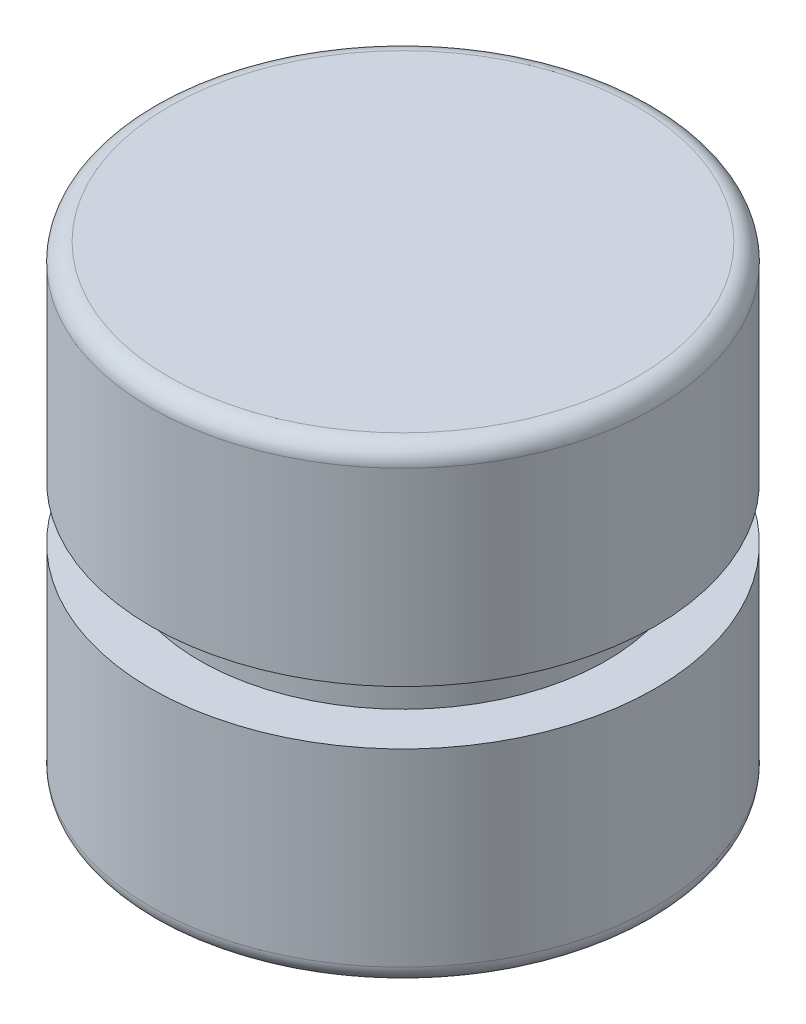
ISO-10303-21;
HEADER;
FILE_DESCRIPTION(('STEP AP214'),'2;1');
FILE_NAME('part.step','',(''),(''),'','','');
FILE_SCHEMA(('AUTOMOTIVE_DESIGN { 1 0 10303 214 1 1 1 1 }'));
ENDSEC;
DATA;
#1=APPLICATION_CONTEXT('core data for automotive mechanical design processes');
#2=APPLICATION_PROTOCOL_DEFINITION('international standard','automotive_design',2000,#1);
#3=PRODUCT_CONTEXT('',#1,'mechanical');
#4=PRODUCT('Part','Part','',(#3));
#5=PRODUCT_RELATED_PRODUCT_CATEGORY('part','',(#4));
#6=PRODUCT_DEFINITION_FORMATION('','',#4);
#7=PRODUCT_DEFINITION_CONTEXT('part definition',#1,'design');
#8=PRODUCT_DEFINITION('design','',#6,#7);
#9=PRODUCT_DEFINITION_SHAPE('','',#8);
#10=(LENGTH_UNIT() NAMED_UNIT(*) SI_UNIT(.MILLI.,.METRE.));
#11=(NAMED_UNIT(*) PLANE_ANGLE_UNIT() SI_UNIT($,.RADIAN.));
#12=(NAMED_UNIT(*) SI_UNIT($,.STERADIAN.) SOLID_ANGLE_UNIT());
#13=UNCERTAINTY_MEASURE_WITH_UNIT(LENGTH_MEASURE(1.E-05),#10,'distance_accuracy_value','');
#14=(GEOMETRIC_REPRESENTATION_CONTEXT(3) GLOBAL_UNCERTAINTY_ASSIGNED_CONTEXT((#13)) GLOBAL_UNIT_ASSIGNED_CONTEXT((#10,
#11,#12)) REPRESENTATION_CONTEXT('',''));
#15=CARTESIAN_POINT('',(0.,0.,0.));
#16=DIRECTION('',(0.,0.,1.));
#17=DIRECTION('',(1.,0.,0.));
#18=AXIS2_PLACEMENT_3D('',#15,#16,#17);
#19=CARTESIAN_POINT('',(8.89,0.,0.));
#20=DIRECTION('',(0.,-1.,0.));
#21=DIRECTION('',(0.,0.,-1.));
#22=AXIS2_PLACEMENT_3D('',#19,#20,#21);
#23=PLANE('',#22);
#24=CARTESIAN_POINT('',(0.,0.,0.));
#25=DIRECTION('',(0.,-1.,0.));
#26=DIRECTION('',(0.,0.,-1.));
#27=AXIS2_PLACEMENT_3D('',#24,#25,#26);
#28=CIRCLE('',#27,8.255);
#29=CARTESIAN_POINT('',(0.,0.,-8.255));
#30=VERTEX_POINT('',#29);
#31=EDGE_CURVE('E59',#30,#30,#28,.T.);
#32=ORIENTED_EDGE('',*,*,#31,.T.);
#33=EDGE_LOOP('',(#32));
#34=FACE_BOUND('',#33,.T.);
#35=CARTESIAN_POINT('',(0.,0.,0.));
#36=DIRECTION('',(0.,-1.,0.));
#37=DIRECTION('',(0.,0.,-1.));
#38=AXIS2_PLACEMENT_3D('',#35,#36,#37);
#39=CIRCLE('',#38,4.445);
#40=CARTESIAN_POINT('',(0.,0.,-4.445));
#41=VERTEX_POINT('',#40);
#42=EDGE_CURVE('E65',#41,#41,#39,.T.);
#43=ORIENTED_EDGE('',*,*,#42,.F.);
#44=EDGE_LOOP('',(#43));
#45=FACE_BOUND('',#44,.T.);
#46=ADVANCED_FACE('F41',(#34,#45),#23,.T.);
#47=CARTESIAN_POINT('',(0.,0.,0.));
#48=DIRECTION('',(0.,-1.,0.));
#49=DIRECTION('',(0.,0.,-1.));
#50=AXIS2_PLACEMENT_3D('',#47,#48,#49);
#51=CYLINDRICAL_SURFACE('',#50,4.445);
#52=ORIENTED_EDGE('',*,*,#42,.T.);
#53=EDGE_LOOP('',(#52));
#54=FACE_BOUND('',#53,.T.);
#55=CARTESIAN_POINT('',(0.,12.7,0.));
#56=DIRECTION('',(0.,-1.,0.));
#57=DIRECTION('',(0.,0.,-1.));
#58=AXIS2_PLACEMENT_3D('',#55,#56,#57);
#59=CIRCLE('',#58,4.445);
#60=CARTESIAN_POINT('',(0.,12.7,-4.445));
#61=VERTEX_POINT('',#60);
#62=EDGE_CURVE('E69',#61,#61,#59,.T.);
#63=ORIENTED_EDGE('',*,*,#62,.F.);
#64=EDGE_LOOP('',(#63));
#65=FACE_BOUND('',#64,.T.);
#66=ADVANCED_FACE('F108',(#54,#65),#51,.F.);
#67=CARTESIAN_POINT('',(4.445,12.7,0.));
#68=DIRECTION('',(0.,-1.,0.));
#69=DIRECTION('',(0.,0.,-1.));
#70=AXIS2_PLACEMENT_3D('',#67,#68,#69);
#71=PLANE('',#70);
#72=ORIENTED_EDGE('',*,*,#62,.T.);
#73=EDGE_LOOP('',(#72));
#74=FACE_BOUND('',#73,.T.);
#75=ADVANCED_FACE('F114',(#74),#71,.T.);
#76=CARTESIAN_POINT('',(0.,16.51,0.));
#77=DIRECTION('',(0.,1.,0.));
#78=DIRECTION('',(0.,0.,1.));
#79=AXIS2_PLACEMENT_3D('',#76,#77,#78);
#80=PLANE('',#79);
#81=CARTESIAN_POINT('',(0.,16.51,0.));
#82=DIRECTION('',(0.,1.,0.));
#83=DIRECTION('',(0.,0.,1.));
#84=AXIS2_PLACEMENT_3D('',#81,#82,#83);
#85=CIRCLE('',#84,8.255);
#86=CARTESIAN_POINT('',(0.,16.51,8.255));
#87=VERTEX_POINT('',#86);
#88=EDGE_CURVE('E10',#87,#87,#85,.T.);
#89=ORIENTED_EDGE('',*,*,#88,.T.);
#90=EDGE_LOOP('',(#89));
#91=FACE_BOUND('',#90,.T.);
#92=ADVANCED_FACE('F155',(#91),#80,.T.);
#93=CARTESIAN_POINT('',(0.,0.,0.));
#94=DIRECTION('',(0.,-1.,0.));
#95=DIRECTION('',(0.,0.,-1.));
#96=AXIS2_PLACEMENT_3D('',#93,#94,#95);
#97=CYLINDRICAL_SURFACE('',#96,8.89);
#98=CARTESIAN_POINT('',(0.,15.875,0.));
#99=DIRECTION('',(0.,1.,0.));
#100=DIRECTION('',(0.,0.,1.));
#101=AXIS2_PLACEMENT_3D('',#98,#99,#100);
#102=CIRCLE('',#101,8.89);
#103=CARTESIAN_POINT('',(0.,15.875,8.89));
#104=VERTEX_POINT('',#103);
#105=EDGE_CURVE('E49',#104,#104,#102,.F.);
#106=ORIENTED_EDGE('',*,*,#105,.T.);
#107=EDGE_LOOP('',(#106));
#108=FACE_BOUND('',#107,.T.);
#109=CARTESIAN_POINT('',(0.,9.2075,0.));
#110=DIRECTION('',(0.,-1.,0.));
#111=DIRECTION('',(0.,0.,-1.));
#112=AXIS2_PLACEMENT_3D('',#109,#110,#111);
#113=CIRCLE('',#112,8.89);
#114=CARTESIAN_POINT('',(0.,9.2075,-8.89));
#115=VERTEX_POINT('',#114);
#116=EDGE_CURVE('E73',#115,#115,#113,.T.);
#117=ORIENTED_EDGE('',*,*,#116,.F.);
#118=EDGE_LOOP('',(#117));
#119=FACE_BOUND('',#118,.T.);
#120=ADVANCED_FACE('F150',(#108,#119),#97,.T.);
#121=CARTESIAN_POINT('',(8.89,9.2075,0.));
#122=DIRECTION('',(0.,-1.,0.));
#123=DIRECTION('',(0.,0.,-1.));
#124=AXIS2_PLACEMENT_3D('',#121,#122,#123);
#125=PLANE('',#124);
#126=ORIENTED_EDGE('',*,*,#116,.T.);
#127=EDGE_LOOP('',(#126));
#128=FACE_BOUND('',#127,.T.);
#129=CARTESIAN_POINT('',(0.,9.2075,0.));
#130=DIRECTION('',(0.,-1.,0.));
#131=DIRECTION('',(0.,0.,-1.));
#132=AXIS2_PLACEMENT_3D('',#129,#130,#131);
#133=CIRCLE('',#132,7.1755);
#134=CARTESIAN_POINT('',(0.,9.2075,-7.1755));
#135=VERTEX_POINT('',#134);
#136=EDGE_CURVE('E77',#135,#135,#133,.T.);
#137=ORIENTED_EDGE('',*,*,#136,.F.);
#138=EDGE_LOOP('',(#137));
#139=FACE_BOUND('',#138,.T.);
#140=ADVANCED_FACE('F104',(#128,#139),#125,.T.);
#141=CARTESIAN_POINT('',(0.,0.,0.));
#142=DIRECTION('',(0.,-1.,0.));
#143=DIRECTION('',(0.,0.,-1.));
#144=AXIS2_PLACEMENT_3D('',#141,#142,#143);
#145=CYLINDRICAL_SURFACE('',#144,7.1755);
#146=ORIENTED_EDGE('',*,*,#136,.T.);
#147=EDGE_LOOP('',(#146));
#148=FACE_BOUND('',#147,.T.);
#149=CARTESIAN_POINT('',(0.,7.3025,0.));
#150=DIRECTION('',(0.,-1.,0.));
#151=DIRECTION('',(0.,0.,-1.));
#152=AXIS2_PLACEMENT_3D('',#149,#150,#151);
#153=CIRCLE('',#152,7.1755);
#154=CARTESIAN_POINT('',(0.,7.3025,-7.1755));
#155=VERTEX_POINT('',#154);
#156=EDGE_CURVE('E81',#155,#155,#153,.T.);
#157=ORIENTED_EDGE('',*,*,#156,.F.);
#158=EDGE_LOOP('',(#157));
#159=FACE_BOUND('',#158,.T.);
#160=ADVANCED_FACE('F94',(#148,#159),#145,.T.);
#161=CARTESIAN_POINT('',(7.1755,7.3025,0.));
#162=DIRECTION('',(0.,1.,0.));
#163=DIRECTION('',(0.,0.,1.));
#164=AXIS2_PLACEMENT_3D('',#161,#162,#163);
#165=PLANE('',#164);
#166=ORIENTED_EDGE('',*,*,#156,.T.);
#167=EDGE_LOOP('',(#166));
#168=FACE_BOUND('',#167,.T.);
#169=CARTESIAN_POINT('',(0.,7.3025,0.));
#170=DIRECTION('',(0.,-1.,0.));
#171=DIRECTION('',(0.,0.,-1.));
#172=AXIS2_PLACEMENT_3D('',#169,#170,#171);
#173=CIRCLE('',#172,8.89);
#174=CARTESIAN_POINT('',(0.,7.3025,-8.89));
#175=VERTEX_POINT('',#174);
#176=EDGE_CURVE('E85',#175,#175,#173,.T.);
#177=ORIENTED_EDGE('',*,*,#176,.F.);
#178=EDGE_LOOP('',(#177));
#179=FACE_BOUND('',#178,.T.);
#180=ADVANCED_FACE('F92',(#168,#179),#165,.T.);
#181=CARTESIAN_POINT('',(0.,0.,0.));
#182=DIRECTION('',(0.,-1.,0.));
#183=DIRECTION('',(0.,0.,-1.));
#184=AXIS2_PLACEMENT_3D('',#181,#182,#183);
#185=CYLINDRICAL_SURFACE('',#184,8.89);
#186=CARTESIAN_POINT('',(0.,0.635,0.));
#187=DIRECTION('',(0.,-1.,0.));
#188=DIRECTION('',(0.,0.,-1.));
#189=AXIS2_PLACEMENT_3D('',#186,#187,#188);
#190=CIRCLE('',#189,8.89);
#191=CARTESIAN_POINT('',(0.,0.635,-8.89));
#192=VERTEX_POINT('',#191);
#193=EDGE_CURVE('E54',#192,#192,#190,.F.);
#194=ORIENTED_EDGE('',*,*,#193,.T.);
#195=EDGE_LOOP('',(#194));
#196=FACE_BOUND('',#195,.T.);
#197=ORIENTED_EDGE('',*,*,#176,.T.);
#198=EDGE_LOOP('',(#197));
#199=FACE_BOUND('',#198,.T.);
#200=ADVANCED_FACE('F90',(#196,#199),#185,.T.);
#201=CARTESIAN_POINT('',(0.,0.635,0.));
#202=DIRECTION('',(0.,-1.,0.));
#203=DIRECTION('',(0.,0.,-1.));
#204=AXIS2_PLACEMENT_3D('',#201,#202,#203);
#205=TOROIDAL_SURFACE('',#204,8.255,0.635);
#206=ORIENTED_EDGE('',*,*,#193,.F.);
#207=EDGE_LOOP('',(#206));
#208=FACE_BOUND('',#207,.T.);
#209=ORIENTED_EDGE('',*,*,#31,.F.);
#210=EDGE_LOOP('',(#209));
#211=FACE_BOUND('',#210,.T.);
#212=ADVANCED_FACE('F101',(#208,#211),#205,.T.);
#213=CARTESIAN_POINT('',(0.,15.875,0.));
#214=DIRECTION('',(0.,1.,0.));
#215=DIRECTION('',(0.,0.,1.));
#216=AXIS2_PLACEMENT_3D('',#213,#214,#215);
#217=TOROIDAL_SURFACE('',#216,8.255,0.635);
#218=ORIENTED_EDGE('',*,*,#88,.F.);
#219=EDGE_LOOP('',(#218));
#220=FACE_BOUND('',#219,.T.);
#221=ORIENTED_EDGE('',*,*,#105,.F.);
#222=EDGE_LOOP('',(#221));
#223=FACE_BOUND('',#222,.T.);
#224=ADVANCED_FACE('F43',(#220,#223),#217,.T.);
#225=CLOSED_SHELL('',(#46,#66,#75,#92,#120,#140,#160,#180,#200,#212,#224));
#226=MANIFOLD_SOLID_BREP('B2',#225);
#227=ADVANCED_BREP_SHAPE_REPRESENTATION('',(#18,#226),#14);
#228=SHAPE_DEFINITION_REPRESENTATION(#9,#227);
ENDSEC;
END-ISO-10303-21;
